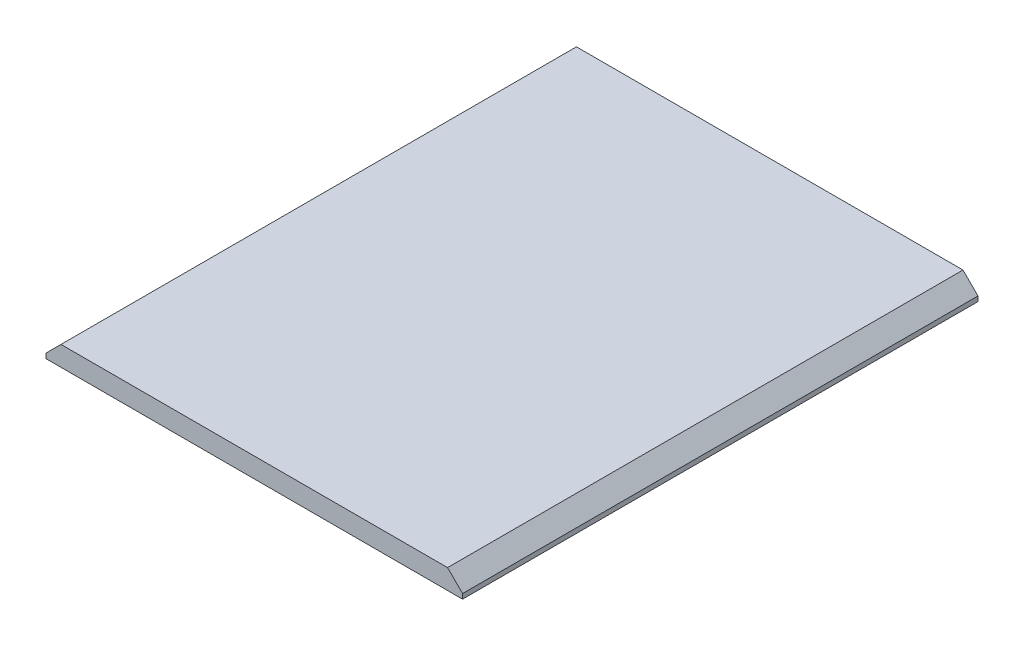
ISO-10303-21;
HEADER;
FILE_DESCRIPTION(('STEP AP214'),'2;1');
FILE_NAME('part.step','',(''),(''),'','','');
FILE_SCHEMA(('AUTOMOTIVE_DESIGN { 1 0 10303 214 1 1 1 1 }'));
ENDSEC;
DATA;
#1=APPLICATION_CONTEXT('core data for automotive mechanical design processes');
#2=APPLICATION_PROTOCOL_DEFINITION('international standard','automotive_design',2000,#1);
#3=PRODUCT_CONTEXT('',#1,'mechanical');
#4=PRODUCT('Part','Part','',(#3));
#5=PRODUCT_RELATED_PRODUCT_CATEGORY('part','',(#4));
#6=PRODUCT_DEFINITION_FORMATION('','',#4);
#7=PRODUCT_DEFINITION_CONTEXT('part definition',#1,'design');
#8=PRODUCT_DEFINITION('design','',#6,#7);
#9=PRODUCT_DEFINITION_SHAPE('','',#8);
#10=(LENGTH_UNIT() NAMED_UNIT(*) SI_UNIT(.MILLI.,.METRE.));
#11=(NAMED_UNIT(*) PLANE_ANGLE_UNIT() SI_UNIT($,.RADIAN.));
#12=(NAMED_UNIT(*) SI_UNIT($,.STERADIAN.) SOLID_ANGLE_UNIT());
#13=UNCERTAINTY_MEASURE_WITH_UNIT(LENGTH_MEASURE(1.E-05),#10,'distance_accuracy_value','');
#14=(GEOMETRIC_REPRESENTATION_CONTEXT(3) GLOBAL_UNCERTAINTY_ASSIGNED_CONTEXT((#13)) GLOBAL_UNIT_ASSIGNED_CONTEXT((#10,
#11,#12)) REPRESENTATION_CONTEXT('',''));
#15=CARTESIAN_POINT('',(0.,0.,0.));
#16=DIRECTION('',(0.,0.,1.));
#17=DIRECTION('',(1.,0.,0.));
#18=AXIS2_PLACEMENT_3D('',#15,#16,#17);
#19=CARTESIAN_POINT('',(-2.,0.,68.8));
#20=DIRECTION('',(1.,0.,0.));
#21=DIRECTION('',(0.,0.,-1.));
#22=AXIS2_PLACEMENT_3D('',#19,#20,#21);
#23=PLANE('',#22);
#24=DIRECTION('',(0.,-1.,0.));
#25=VECTOR('',#24,1.);
#26=CARTESIAN_POINT('',(-2.,0.,0.));
#27=LINE('',#26,#25);
#28=CARTESIAN_POINT('',(-2.,0.649999999999978,0.));
#29=VERTEX_POINT('',#28);
#30=CARTESIAN_POINT('',(-2.,0.,0.));
#31=VERTEX_POINT('',#30);
#32=EDGE_CURVE('E115',#29,#31,#27,.T.);
#33=ORIENTED_EDGE('',*,*,#32,.T.);
#34=DIRECTION('',(0.,0.,-1.));
#35=VECTOR('',#34,1.);
#36=CARTESIAN_POINT('',(-2.,0.,68.8));
#37=LINE('',#36,#35);
#38=CARTESIAN_POINT('',(-2.,0.,68.8));
#39=VERTEX_POINT('',#38);
#40=EDGE_CURVE('E11',#39,#31,#37,.T.);
#41=ORIENTED_EDGE('',*,*,#40,.F.);
#42=DIRECTION('',(0.,-1.,0.));
#43=VECTOR('',#42,1.);
#44=CARTESIAN_POINT('',(-2.,0.,68.8));
#45=LINE('',#44,#43);
#46=CARTESIAN_POINT('',(-2.,0.649999999999978,68.8));
#47=VERTEX_POINT('',#46);
#48=EDGE_CURVE('E139',#47,#39,#45,.T.);
#49=ORIENTED_EDGE('',*,*,#48,.F.);
#50=DIRECTION('',(0.,0.,-1.));
#51=VECTOR('',#50,1.);
#52=CARTESIAN_POINT('',(-2.,0.649999999999978,68.8));
#53=LINE('',#52,#51);
#54=EDGE_CURVE('E149',#47,#29,#53,.T.);
#55=ORIENTED_EDGE('',*,*,#54,.T.);
#56=EDGE_LOOP('',(#33,#41,#49,#55));
#57=FACE_BOUND('',#56,.T.);
#58=ADVANCED_FACE('F45',(#57),#23,.F.);
#59=CARTESIAN_POINT('',(0.,0.,68.8));
#60=DIRECTION('',(0.,1.,0.));
#61=DIRECTION('',(0.,0.,1.));
#62=AXIS2_PLACEMENT_3D('',#59,#60,#61);
#63=PLANE('',#62);
#64=DIRECTION('',(1.,0.,0.));
#65=VECTOR('',#64,1.);
#66=CARTESIAN_POINT('',(0.,0.,0.));
#67=LINE('',#66,#65);
#68=CARTESIAN_POINT('',(53.6,0.,0.));
#69=VERTEX_POINT('',#68);
#70=EDGE_CURVE('E153',#31,#69,#67,.T.);
#71=ORIENTED_EDGE('',*,*,#70,.T.);
#72=DIRECTION('',(0.,0.,-1.));
#73=VECTOR('',#72,1.);
#74=CARTESIAN_POINT('',(53.6,0.,68.8));
#75=LINE('',#74,#73);
#76=CARTESIAN_POINT('',(53.6,0.,68.8));
#77=VERTEX_POINT('',#76);
#78=EDGE_CURVE('E128',#77,#69,#75,.T.);
#79=ORIENTED_EDGE('',*,*,#78,.F.);
#80=DIRECTION('',(1.,0.,0.));
#81=VECTOR('',#80,1.);
#82=CARTESIAN_POINT('',(0.,0.,68.8));
#83=LINE('',#82,#81);
#84=EDGE_CURVE('E83',#39,#77,#83,.T.);
#85=ORIENTED_EDGE('',*,*,#84,.F.);
#86=ORIENTED_EDGE('',*,*,#40,.T.);
#87=EDGE_LOOP('',(#71,#79,#85,#86));
#88=FACE_BOUND('',#87,.T.);
#89=ADVANCED_FACE('F170',(#88),#63,.F.);
#90=CARTESIAN_POINT('',(0.,2.65,68.8));
#91=DIRECTION('',(0.,1.,0.));
#92=DIRECTION('',(0.,0.,1.));
#93=AXIS2_PLACEMENT_3D('',#90,#91,#92);
#94=PLANE('',#93);
#95=DIRECTION('',(1.,0.,0.));
#96=VECTOR('',#95,1.);
#97=CARTESIAN_POINT('',(0.,2.65,0.));
#98=LINE('',#97,#96);
#99=CARTESIAN_POINT('',(0.,2.65,0.));
#100=VERTEX_POINT('',#99);
#101=CARTESIAN_POINT('',(51.6,2.65,0.));
#102=VERTEX_POINT('',#101);
#103=EDGE_CURVE('E156',#100,#102,#98,.T.);
#104=ORIENTED_EDGE('',*,*,#103,.F.);
#105=DIRECTION('',(0.,0.,-1.));
#106=VECTOR('',#105,1.);
#107=CARTESIAN_POINT('',(0.,2.65,68.8));
#108=LINE('',#107,#106);
#109=CARTESIAN_POINT('',(0.,2.65,68.8));
#110=VERTEX_POINT('',#109);
#111=EDGE_CURVE('E54',#110,#100,#108,.T.);
#112=ORIENTED_EDGE('',*,*,#111,.F.);
#113=DIRECTION('',(1.,0.,0.));
#114=VECTOR('',#113,1.);
#115=CARTESIAN_POINT('',(0.,2.65,68.8));
#116=LINE('',#115,#114);
#117=CARTESIAN_POINT('',(51.6,2.65,68.8));
#118=VERTEX_POINT('',#117);
#119=EDGE_CURVE('E144',#110,#118,#116,.T.);
#120=ORIENTED_EDGE('',*,*,#119,.T.);
#121=DIRECTION('',(0.,0.,-1.));
#122=VECTOR('',#121,1.);
#123=CARTESIAN_POINT('',(51.6,2.65,68.8));
#124=LINE('',#123,#122);
#125=EDGE_CURVE('E116',#118,#102,#124,.T.);
#126=ORIENTED_EDGE('',*,*,#125,.T.);
#127=EDGE_LOOP('',(#104,#112,#120,#126));
#128=FACE_BOUND('',#127,.T.);
#129=ADVANCED_FACE('F172',(#128),#94,.T.);
#130=CARTESIAN_POINT('',(-1.325,1.32499999999999,68.8));
#131=DIRECTION('',(0.707106781186551,-0.707106781186544,0.));
#132=DIRECTION('',(0.707106781186544,0.707106781186551,0.));
#133=AXIS2_PLACEMENT_3D('',#130,#131,#132);
#134=PLANE('',#133);
#135=DIRECTION('',(-0.707106781186544,-0.707106781186551,0.));
#136=VECTOR('',#135,1.);
#137=CARTESIAN_POINT('',(-1.325,1.32499999999999,0.));
#138=LINE('',#137,#136);
#139=EDGE_CURVE('E77',#100,#29,#138,.T.);
#140=ORIENTED_EDGE('',*,*,#139,.T.);
#141=ORIENTED_EDGE('',*,*,#54,.F.);
#142=DIRECTION('',(-0.707106781186544,-0.707106781186551,0.));
#143=VECTOR('',#142,1.);
#144=CARTESIAN_POINT('',(-1.325,1.32499999999999,68.8));
#145=LINE('',#144,#143);
#146=EDGE_CURVE('E62',#110,#47,#145,.T.);
#147=ORIENTED_EDGE('',*,*,#146,.F.);
#148=ORIENTED_EDGE('',*,*,#111,.T.);
#149=EDGE_LOOP('',(#140,#141,#147,#148));
#150=FACE_BOUND('',#149,.T.);
#151=ADVANCED_FACE('F177',(#150),#134,.F.);
#152=CARTESIAN_POINT('',(0.,0.,68.8));
#153=DIRECTION('',(0.,0.,1.));
#154=DIRECTION('',(1.,0.,0.));
#155=AXIS2_PLACEMENT_3D('',#152,#153,#154);
#156=PLANE('',#155);
#157=ORIENTED_EDGE('',*,*,#48,.T.);
#158=ORIENTED_EDGE('',*,*,#84,.T.);
#159=DIRECTION('',(0.,-1.,0.));
#160=VECTOR('',#159,1.);
#161=CARTESIAN_POINT('',(53.6,0.,68.8));
#162=LINE('',#161,#160);
#163=CARTESIAN_POINT('',(53.6,0.649999999999978,68.8));
#164=VERTEX_POINT('',#163);
#165=EDGE_CURVE('E107',#164,#77,#162,.T.);
#166=ORIENTED_EDGE('',*,*,#165,.F.);
#167=DIRECTION('',(0.707106781186544,-0.707106781186551,0.));
#168=VECTOR('',#167,1.);
#169=CARTESIAN_POINT('',(52.925,1.32499999999999,68.8));
#170=LINE('',#169,#168);
#171=EDGE_CURVE('E120',#118,#164,#170,.T.);
#172=ORIENTED_EDGE('',*,*,#171,.F.);
#173=ORIENTED_EDGE('',*,*,#119,.F.);
#174=ORIENTED_EDGE('',*,*,#146,.T.);
#175=EDGE_LOOP('',(#157,#158,#166,#172,#173,#174));
#176=FACE_BOUND('',#175,.T.);
#177=ADVANCED_FACE('F119',(#176),#156,.T.);
#178=CARTESIAN_POINT('',(0.,0.,0.));
#179=DIRECTION('',(0.,0.,1.));
#180=DIRECTION('',(1.,0.,0.));
#181=AXIS2_PLACEMENT_3D('',#178,#179,#180);
#182=PLANE('',#181);
#183=ORIENTED_EDGE('',*,*,#32,.F.);
#184=ORIENTED_EDGE('',*,*,#139,.F.);
#185=ORIENTED_EDGE('',*,*,#103,.T.);
#186=DIRECTION('',(0.707106781186544,-0.707106781186551,0.));
#187=VECTOR('',#186,1.);
#188=CARTESIAN_POINT('',(52.925,1.32499999999999,0.));
#189=LINE('',#188,#187);
#190=CARTESIAN_POINT('',(53.6,0.649999999999978,0.));
#191=VERTEX_POINT('',#190);
#192=EDGE_CURVE('E122',#102,#191,#189,.T.);
#193=ORIENTED_EDGE('',*,*,#192,.T.);
#194=DIRECTION('',(0.,-1.,0.));
#195=VECTOR('',#194,1.);
#196=CARTESIAN_POINT('',(53.6,0.,0.));
#197=LINE('',#196,#195);
#198=EDGE_CURVE('E109',#191,#69,#197,.T.);
#199=ORIENTED_EDGE('',*,*,#198,.T.);
#200=ORIENTED_EDGE('',*,*,#70,.F.);
#201=EDGE_LOOP('',(#183,#184,#185,#193,#199,#200));
#202=FACE_BOUND('',#201,.T.);
#203=ADVANCED_FACE('F168',(#202),#182,.F.);
#204=CARTESIAN_POINT('',(53.6,0.,68.8));
#205=DIRECTION('',(1.,0.,0.));
#206=DIRECTION('',(0.,0.,-1.));
#207=AXIS2_PLACEMENT_3D('',#204,#205,#206);
#208=PLANE('',#207);
#209=ORIENTED_EDGE('',*,*,#198,.F.);
#210=DIRECTION('',(0.,0.,-1.));
#211=VECTOR('',#210,1.);
#212=CARTESIAN_POINT('',(53.6,0.649999999999978,68.8));
#213=LINE('',#212,#211);
#214=EDGE_CURVE('E103',#164,#191,#213,.T.);
#215=ORIENTED_EDGE('',*,*,#214,.F.);
#216=ORIENTED_EDGE('',*,*,#165,.T.);
#217=ORIENTED_EDGE('',*,*,#78,.T.);
#218=EDGE_LOOP('',(#209,#215,#216,#217));
#219=FACE_BOUND('',#218,.T.);
#220=ADVANCED_FACE('F105',(#219),#208,.T.);
#221=CARTESIAN_POINT('',(52.925,1.32499999999999,68.8));
#222=DIRECTION('',(0.707106781186551,0.707106781186544,0.));
#223=DIRECTION('',(-0.707106781186544,0.707106781186551,0.));
#224=AXIS2_PLACEMENT_3D('',#221,#222,#223);
#225=PLANE('',#224);
#226=ORIENTED_EDGE('',*,*,#192,.F.);
#227=ORIENTED_EDGE('',*,*,#125,.F.);
#228=ORIENTED_EDGE('',*,*,#171,.T.);
#229=ORIENTED_EDGE('',*,*,#214,.T.);
#230=EDGE_LOOP('',(#226,#227,#228,#229));
#231=FACE_BOUND('',#230,.T.);
#232=ADVANCED_FACE('F125',(#231),#225,.T.);
#233=CLOSED_SHELL('',(#58,#89,#129,#151,#177,#203,#220,#232));
#234=MANIFOLD_SOLID_BREP('B2',#233);
#235=ADVANCED_BREP_SHAPE_REPRESENTATION('',(#18,#234),#14);
#236=SHAPE_DEFINITION_REPRESENTATION(#9,#235);
ENDSEC;
END-ISO-10303-21;
